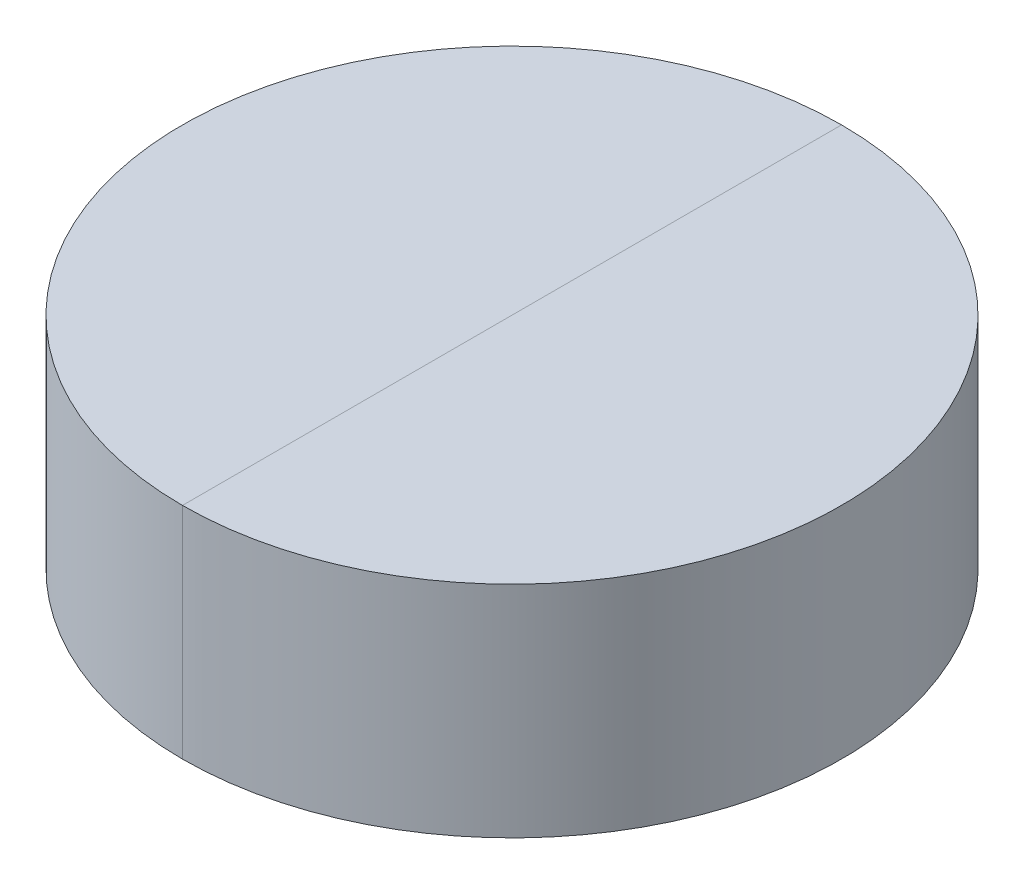
ISO-10303-21;
HEADER;
FILE_DESCRIPTION(('STEP AP214'),'2;1');
FILE_NAME('part.step','',(''),(''),'','','');
FILE_SCHEMA(('AUTOMOTIVE_DESIGN { 1 0 10303 214 1 1 1 1 }'));
ENDSEC;
DATA;
#1=APPLICATION_CONTEXT('core data for automotive mechanical design processes');
#2=APPLICATION_PROTOCOL_DEFINITION('international standard','automotive_design',2000,#1);
#3=PRODUCT_CONTEXT('',#1,'mechanical');
#4=PRODUCT('Part','Part','',(#3));
#5=PRODUCT_RELATED_PRODUCT_CATEGORY('part','',(#4));
#6=PRODUCT_DEFINITION_FORMATION('','',#4);
#7=PRODUCT_DEFINITION_CONTEXT('part definition',#1,'design');
#8=PRODUCT_DEFINITION('design','',#6,#7);
#9=PRODUCT_DEFINITION_SHAPE('','',#8);
#10=(LENGTH_UNIT() NAMED_UNIT(*) SI_UNIT(.MILLI.,.METRE.));
#11=(NAMED_UNIT(*) PLANE_ANGLE_UNIT() SI_UNIT($,.RADIAN.));
#12=(NAMED_UNIT(*) SI_UNIT($,.STERADIAN.) SOLID_ANGLE_UNIT());
#13=UNCERTAINTY_MEASURE_WITH_UNIT(LENGTH_MEASURE(1.E-05),#10,'distance_accuracy_value','');
#14=(GEOMETRIC_REPRESENTATION_CONTEXT(3) GLOBAL_UNCERTAINTY_ASSIGNED_CONTEXT((#13)) GLOBAL_UNIT_ASSIGNED_CONTEXT((#10,
#11,#12)) REPRESENTATION_CONTEXT('',''));
#15=CARTESIAN_POINT('',(0.,0.,0.));
#16=DIRECTION('',(0.,0.,1.));
#17=DIRECTION('',(1.,0.,0.));
#18=AXIS2_PLACEMENT_3D('',#15,#16,#17);
#19=CARTESIAN_POINT('',(0.,8.70820393249937,0.));
#20=DIRECTION('',(0.,-1.,0.));
#21=DIRECTION('',(0.,0.,-1.));
#22=AXIS2_PLACEMENT_3D('',#19,#20,#21);
#23=CYLINDRICAL_SURFACE('',#22,3.);
#24=CARTESIAN_POINT('',(0.,2.,0.));
#25=DIRECTION('',(0.,1.,0.));
#26=DIRECTION('',(0.,0.,1.));
#27=AXIS2_PLACEMENT_3D('',#24,#25,#26);
#28=CIRCLE('',#27,3.);
#29=CARTESIAN_POINT('',(0.,2.,3.));
#30=VERTEX_POINT('',#29);
#31=CARTESIAN_POINT('',(0.,2.,-3.));
#32=VERTEX_POINT('',#31);
#33=EDGE_CURVE('E12',#30,#32,#28,.T.);
#34=ORIENTED_EDGE('',*,*,#33,.F.);
#35=DIRECTION('',(0.,-1.,0.));
#36=VECTOR('',#35,1.);
#37=CARTESIAN_POINT('',(0.,8.70820393249937,3.));
#38=LINE('',#37,#36);
#39=CARTESIAN_POINT('',(0.,0.,3.));
#40=VERTEX_POINT('',#39);
#41=EDGE_CURVE('E47',#30,#40,#38,.T.);
#42=ORIENTED_EDGE('',*,*,#41,.T.);
#43=CARTESIAN_POINT('',(0.,0.,0.));
#44=DIRECTION('',(0.,1.,0.));
#45=DIRECTION('',(0.,0.,1.));
#46=AXIS2_PLACEMENT_3D('',#43,#44,#45);
#47=CIRCLE('',#46,3.);
#48=CARTESIAN_POINT('',(0.,0.,-3.));
#49=VERTEX_POINT('',#48);
#50=EDGE_CURVE('E72',#40,#49,#47,.T.);
#51=ORIENTED_EDGE('',*,*,#50,.T.);
#52=DIRECTION('',(0.,-1.,0.));
#53=VECTOR('',#52,1.);
#54=CARTESIAN_POINT('',(0.,8.70820393249937,-3.));
#55=LINE('',#54,#53);
#56=EDGE_CURVE('E64',#32,#49,#55,.T.);
#57=ORIENTED_EDGE('',*,*,#56,.F.);
#58=EDGE_LOOP('',(#34,#42,#51,#57));
#59=FACE_BOUND('',#58,.T.);
#60=ADVANCED_FACE('F43',(#59),#23,.T.);
#61=CARTESIAN_POINT('',(0.,8.70820393249937,3.));
#62=DIRECTION('',(1.,0.,0.));
#63=DIRECTION('',(0.,0.,-1.));
#64=AXIS2_PLACEMENT_3D('',#61,#62,#63);
#65=PLANE('',#64);
#66=DIRECTION('',(0.,0.,1.));
#67=VECTOR('',#66,1.);
#68=CARTESIAN_POINT('',(0.,2.,3.));
#69=LINE('',#68,#67);
#70=EDGE_CURVE('E52',#32,#30,#69,.T.);
#71=ORIENTED_EDGE('',*,*,#70,.F.);
#72=ORIENTED_EDGE('',*,*,#56,.T.);
#73=DIRECTION('',(0.,0.,1.));
#74=VECTOR('',#73,1.);
#75=CARTESIAN_POINT('',(0.,0.,3.));
#76=LINE('',#75,#74);
#77=EDGE_CURVE('E74',#49,#40,#76,.T.);
#78=ORIENTED_EDGE('',*,*,#77,.T.);
#79=ORIENTED_EDGE('',*,*,#41,.F.);
#80=EDGE_LOOP('',(#71,#72,#78,#79));
#81=FACE_BOUND('',#80,.T.);
#82=ADVANCED_FACE('F75',(#81),#65,.F.);
#83=CARTESIAN_POINT('',(0.,0.,0.));
#84=DIRECTION('',(0.,1.,0.));
#85=DIRECTION('',(0.,0.,1.));
#86=AXIS2_PLACEMENT_3D('',#83,#84,#85);
#87=PLANE('',#86);
#88=ORIENTED_EDGE('',*,*,#50,.F.);
#89=ORIENTED_EDGE('',*,*,#77,.F.);
#90=EDGE_LOOP('',(#88,#89));
#91=FACE_BOUND('',#90,.T.);
#92=ADVANCED_FACE('F78',(#91),#87,.F.);
#93=CARTESIAN_POINT('',(0.,2.,0.));
#94=DIRECTION('',(0.,1.,0.));
#95=DIRECTION('',(0.,0.,1.));
#96=AXIS2_PLACEMENT_3D('',#93,#94,#95);
#97=PLANE('',#96);
#98=ORIENTED_EDGE('',*,*,#70,.T.);
#99=ORIENTED_EDGE('',*,*,#33,.T.);
#100=EDGE_LOOP('',(#98,#99));
#101=FACE_BOUND('',#100,.T.);
#102=ADVANCED_FACE('F45',(#101),#97,.T.);
#103=CLOSED_SHELL('',(#60,#82,#92,#102));
#104=MANIFOLD_SOLID_BREP('B2',#103);
#105=CARTESIAN_POINT('',(0.,2.,0.));
#106=DIRECTION('',(0.,-1.,0.));
#107=DIRECTION('',(0.,0.,-1.));
#108=AXIS2_PLACEMENT_3D('',#105,#106,#107);
#109=CYLINDRICAL_SURFACE('',#108,3.);
#110=CARTESIAN_POINT('',(0.,0.,0.));
#111=DIRECTION('',(0.,1.,0.));
#112=DIRECTION('',(0.,0.,1.));
#113=AXIS2_PLACEMENT_3D('',#110,#111,#112);
#114=CIRCLE('',#113,3.);
#115=CARTESIAN_POINT('',(0.,0.,-3.));
#116=VERTEX_POINT('',#115);
#117=CARTESIAN_POINT('',(0.,0.,3.));
#118=VERTEX_POINT('',#117);
#119=EDGE_CURVE('E146',#116,#118,#114,.T.);
#120=ORIENTED_EDGE('',*,*,#119,.T.);
#121=DIRECTION('',(0.,-1.,0.));
#122=VECTOR('',#121,1.);
#123=CARTESIAN_POINT('',(0.,2.,3.));
#124=LINE('',#123,#122);
#125=CARTESIAN_POINT('',(0.,2.,3.));
#126=VERTEX_POINT('',#125);
#127=EDGE_CURVE('E41',#126,#118,#124,.T.);
#128=ORIENTED_EDGE('',*,*,#127,.F.);
#129=CARTESIAN_POINT('',(0.,2.,0.));
#130=DIRECTION('',(0.,1.,0.));
#131=DIRECTION('',(0.,0.,1.));
#132=AXIS2_PLACEMENT_3D('',#129,#130,#131);
#133=CIRCLE('',#132,3.);
#134=CARTESIAN_POINT('',(0.,2.,-3.));
#135=VERTEX_POINT('',#134);
#136=EDGE_CURVE('E145',#135,#126,#133,.T.);
#137=ORIENTED_EDGE('',*,*,#136,.F.);
#138=DIRECTION('',(0.,-1.,0.));
#139=VECTOR('',#138,1.);
#140=CARTESIAN_POINT('',(0.,2.,-3.));
#141=LINE('',#140,#139);
#142=EDGE_CURVE('E123',#135,#116,#141,.T.);
#143=ORIENTED_EDGE('',*,*,#142,.T.);
#144=EDGE_LOOP('',(#120,#128,#137,#143));
#145=FACE_BOUND('',#144,.T.);
#146=ADVANCED_FACE('F115',(#145),#109,.T.);
#147=CARTESIAN_POINT('',(0.,2.,-3.));
#148=DIRECTION('',(-1.,0.,0.));
#149=DIRECTION('',(0.,0.,1.));
#150=AXIS2_PLACEMENT_3D('',#147,#148,#149);
#151=PLANE('',#150);
#152=DIRECTION('',(0.,0.,-1.));
#153=VECTOR('',#152,1.);
#154=CARTESIAN_POINT('',(0.,0.,-3.));
#155=LINE('',#154,#153);
#156=EDGE_CURVE('E138',#118,#116,#155,.T.);
#157=ORIENTED_EDGE('',*,*,#156,.T.);
#158=ORIENTED_EDGE('',*,*,#142,.F.);
#159=DIRECTION('',(0.,0.,-1.));
#160=VECTOR('',#159,1.);
#161=CARTESIAN_POINT('',(0.,2.,-3.));
#162=LINE('',#161,#160);
#163=EDGE_CURVE('E130',#126,#135,#162,.T.);
#164=ORIENTED_EDGE('',*,*,#163,.F.);
#165=ORIENTED_EDGE('',*,*,#127,.T.);
#166=EDGE_LOOP('',(#157,#158,#164,#165));
#167=FACE_BOUND('',#166,.T.);
#168=ADVANCED_FACE('F141',(#167),#151,.F.);
#169=CARTESIAN_POINT('',(0.,2.,0.));
#170=DIRECTION('',(0.,1.,0.));
#171=DIRECTION('',(0.,0.,1.));
#172=AXIS2_PLACEMENT_3D('',#169,#170,#171);
#173=PLANE('',#172);
#174=ORIENTED_EDGE('',*,*,#136,.T.);
#175=ORIENTED_EDGE('',*,*,#163,.T.);
#176=EDGE_LOOP('',(#174,#175));
#177=FACE_BOUND('',#176,.T.);
#178=ADVANCED_FACE('F153',(#177),#173,.T.);
#179=CARTESIAN_POINT('',(0.,0.,0.));
#180=DIRECTION('',(0.,1.,0.));
#181=DIRECTION('',(0.,0.,1.));
#182=AXIS2_PLACEMENT_3D('',#179,#180,#181);
#183=PLANE('',#182);
#184=ORIENTED_EDGE('',*,*,#119,.F.);
#185=ORIENTED_EDGE('',*,*,#156,.F.);
#186=EDGE_LOOP('',(#184,#185));
#187=FACE_BOUND('',#186,.T.);
#188=ADVANCED_FACE('F149',(#187),#183,.F.);
#189=CLOSED_SHELL('',(#146,#168,#178,#188));
#190=MANIFOLD_SOLID_BREP('B6',#189);
#191=ADVANCED_BREP_SHAPE_REPRESENTATION('',(#18,#104,#190),#14);
#192=SHAPE_DEFINITION_REPRESENTATION(#9,#191);
ENDSEC;
END-ISO-10303-21;
